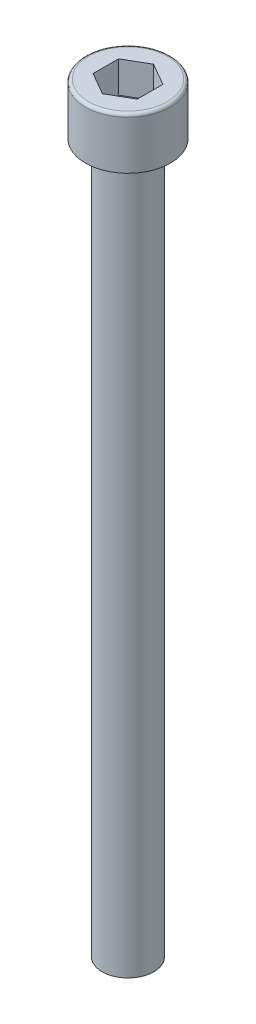
ISO-10303-21;
HEADER;
FILE_DESCRIPTION(('STEP AP214'),'2;1');
FILE_NAME('part.step','',(''),(''),'','','');
FILE_SCHEMA(('AUTOMOTIVE_DESIGN { 1 0 10303 214 1 1 1 1 }'));
ENDSEC;
DATA;
#1=APPLICATION_CONTEXT('core data for automotive mechanical design processes');
#2=APPLICATION_PROTOCOL_DEFINITION('international standard','automotive_design',2000,#1);
#3=PRODUCT_CONTEXT('',#1,'mechanical');
#4=PRODUCT('Part','Part','',(#3));
#5=PRODUCT_RELATED_PRODUCT_CATEGORY('part','',(#4));
#6=PRODUCT_DEFINITION_FORMATION('','',#4);
#7=PRODUCT_DEFINITION_CONTEXT('part definition',#1,'design');
#8=PRODUCT_DEFINITION('design','',#6,#7);
#9=PRODUCT_DEFINITION_SHAPE('','',#8);
#10=(LENGTH_UNIT() NAMED_UNIT(*) SI_UNIT(.MILLI.,.METRE.));
#11=(NAMED_UNIT(*) PLANE_ANGLE_UNIT() SI_UNIT($,.RADIAN.));
#12=(NAMED_UNIT(*) SI_UNIT($,.STERADIAN.) SOLID_ANGLE_UNIT());
#13=UNCERTAINTY_MEASURE_WITH_UNIT(LENGTH_MEASURE(1.E-05),#10,'distance_accuracy_value','');
#14=(GEOMETRIC_REPRESENTATION_CONTEXT(3) GLOBAL_UNCERTAINTY_ASSIGNED_CONTEXT((#13)) GLOBAL_UNIT_ASSIGNED_CONTEXT((#10,
#11,#12)) REPRESENTATION_CONTEXT('',''));
#15=CARTESIAN_POINT('',(0.,0.,0.));
#16=DIRECTION('',(0.,0.,1.));
#17=DIRECTION('',(1.,0.,0.));
#18=AXIS2_PLACEMENT_3D('',#15,#16,#17);
#19=CARTESIAN_POINT('',(0.,-57.15,0.));
#20=DIRECTION('',(0.,1.,0.));
#21=DIRECTION('',(0.,0.,1.));
#22=AXIS2_PLACEMENT_3D('',#19,#20,#21);
#23=CYLINDRICAL_SURFACE('',#22,2.0828);
#24=CARTESIAN_POINT('',(0.,-57.15,0.));
#25=DIRECTION('',(0.,1.,0.));
#26=DIRECTION('',(0.,0.,1.));
#27=AXIS2_PLACEMENT_3D('',#24,#25,#26);
#28=CIRCLE('',#27,2.0828);
#29=CARTESIAN_POINT('',(0.,-57.15,2.0828));
#30=VERTEX_POINT('',#29);
#31=EDGE_CURVE('E144',#30,#30,#28,.T.);
#32=ORIENTED_EDGE('',*,*,#31,.T.);
#33=EDGE_LOOP('',(#32));
#34=FACE_BOUND('',#33,.T.);
#35=CARTESIAN_POINT('',(0.,0.,0.));
#36=DIRECTION('',(0.,1.,0.));
#37=DIRECTION('',(0.,0.,1.));
#38=AXIS2_PLACEMENT_3D('',#35,#36,#37);
#39=CIRCLE('',#38,2.0828);
#40=CARTESIAN_POINT('',(0.,0.,2.0828));
#41=VERTEX_POINT('',#40);
#42=EDGE_CURVE('E143',#41,#41,#39,.T.);
#43=ORIENTED_EDGE('',*,*,#42,.F.);
#44=EDGE_LOOP('',(#43));
#45=FACE_BOUND('',#44,.T.);
#46=ADVANCED_FACE('F33',(#34,#45),#23,.T.);
#47=CARTESIAN_POINT('',(0.,-57.15,0.));
#48=DIRECTION('',(0.,1.,0.));
#49=DIRECTION('',(0.,0.,1.));
#50=AXIS2_PLACEMENT_3D('',#47,#48,#49);
#51=PLANE('',#50);
#52=ORIENTED_EDGE('',*,*,#31,.F.);
#53=EDGE_LOOP('',(#52));
#54=FACE_BOUND('',#53,.T.);
#55=ADVANCED_FACE('F167',(#54),#51,.F.);
#56=CARTESIAN_POINT('',(0.,4.1656,0.));
#57=DIRECTION('',(0.,-1.,0.));
#58=DIRECTION('',(0.,0.,-1.));
#59=AXIS2_PLACEMENT_3D('',#56,#57,#58);
#60=CYLINDRICAL_SURFACE('',#59,3.429);
#61=CARTESIAN_POINT('',(0.,3.9116,0.));
#62=DIRECTION('',(0.,1.,0.));
#63=DIRECTION('',(0.,0.,1.));
#64=AXIS2_PLACEMENT_3D('',#61,#62,#63);
#65=CIRCLE('',#64,3.429);
#66=CARTESIAN_POINT('',(0.,3.9116,3.429));
#67=VERTEX_POINT('',#66);
#68=EDGE_CURVE('E11',#67,#67,#65,.F.);
#69=ORIENTED_EDGE('',*,*,#68,.T.);
#70=EDGE_LOOP('',(#69));
#71=FACE_BOUND('',#70,.T.);
#72=CARTESIAN_POINT('',(0.,0.,0.));
#73=DIRECTION('',(0.,1.,0.));
#74=DIRECTION('',(0.,0.,1.));
#75=AXIS2_PLACEMENT_3D('',#72,#73,#74);
#76=CIRCLE('',#75,3.429);
#77=CARTESIAN_POINT('',(0.,0.,3.429));
#78=VERTEX_POINT('',#77);
#79=EDGE_CURVE('E135',#78,#78,#76,.T.);
#80=ORIENTED_EDGE('',*,*,#79,.T.);
#81=EDGE_LOOP('',(#80));
#82=FACE_BOUND('',#81,.T.);
#83=ADVANCED_FACE('F172',(#71,#82),#60,.T.);
#84=CARTESIAN_POINT('',(0.,4.1656,0.));
#85=DIRECTION('',(0.,1.,0.));
#86=DIRECTION('',(0.,0.,1.));
#87=AXIS2_PLACEMENT_3D('',#84,#85,#86);
#88=PLANE('',#87);
#89=DIRECTION('',(-0.866025403784439,0.,-0.5));
#90=VECTOR('',#89,1.);
#91=CARTESIAN_POINT('',(1.7859375,4.1656,-1.03111149638085));
#92=LINE('',#91,#90);
#93=CARTESIAN_POINT('',(1.7859375,4.1656,-1.03111149638085));
#94=VERTEX_POINT('',#93);
#95=CARTESIAN_POINT('',(0.,4.1656,-2.0622229927617));
#96=VERTEX_POINT('',#95);
#97=EDGE_CURVE('E48',#94,#96,#92,.T.);
#98=ORIENTED_EDGE('',*,*,#97,.F.);
#99=DIRECTION('',(0.,0.,-1.));
#100=VECTOR('',#99,1.);
#101=CARTESIAN_POINT('',(1.7859375,4.1656,1.03111149638085));
#102=LINE('',#101,#100);
#103=CARTESIAN_POINT('',(1.7859375,4.1656,1.03111149638085));
#104=VERTEX_POINT('',#103);
#105=EDGE_CURVE('E131',#104,#94,#102,.T.);
#106=ORIENTED_EDGE('',*,*,#105,.F.);
#107=DIRECTION('',(0.866025403784439,0.,-0.5));
#108=VECTOR('',#107,1.);
#109=CARTESIAN_POINT('',(0.,4.1656,2.0622229927617));
#110=LINE('',#109,#108);
#111=CARTESIAN_POINT('',(0.,4.1656,2.0622229927617));
#112=VERTEX_POINT('',#111);
#113=EDGE_CURVE('E129',#112,#104,#110,.T.);
#114=ORIENTED_EDGE('',*,*,#113,.F.);
#115=DIRECTION('',(0.866025403784439,0.,0.5));
#116=VECTOR('',#115,1.);
#117=CARTESIAN_POINT('',(-1.7859375,4.1656,1.03111149638085));
#118=LINE('',#117,#116);
#119=CARTESIAN_POINT('',(-1.7859375,4.1656,1.03111149638085));
#120=VERTEX_POINT('',#119);
#121=EDGE_CURVE('E96',#120,#112,#118,.T.);
#122=ORIENTED_EDGE('',*,*,#121,.F.);
#123=DIRECTION('',(0.,0.,1.));
#124=VECTOR('',#123,1.);
#125=CARTESIAN_POINT('',(-1.7859375,4.1656,-1.03111149638085));
#126=LINE('',#125,#124);
#127=CARTESIAN_POINT('',(-1.7859375,4.1656,-1.03111149638085));
#128=VERTEX_POINT('',#127);
#129=EDGE_CURVE('E125',#128,#120,#126,.T.);
#130=ORIENTED_EDGE('',*,*,#129,.F.);
#131=DIRECTION('',(-0.866025403784439,0.,0.5));
#132=VECTOR('',#131,1.);
#133=CARTESIAN_POINT('',(0.,4.1656,-2.0622229927617));
#134=LINE('',#133,#132);
#135=EDGE_CURVE('E122',#96,#128,#134,.T.);
#136=ORIENTED_EDGE('',*,*,#135,.F.);
#137=EDGE_LOOP('',(#98,#106,#114,#122,#130,#136));
#138=FACE_BOUND('',#137,.T.);
#139=CARTESIAN_POINT('',(0.,4.1656,0.));
#140=DIRECTION('',(0.,1.,0.));
#141=DIRECTION('',(0.,0.,1.));
#142=AXIS2_PLACEMENT_3D('',#139,#140,#141);
#143=CIRCLE('',#142,3.175);
#144=CARTESIAN_POINT('',(0.,4.1656,3.175));
#145=VERTEX_POINT('',#144);
#146=EDGE_CURVE('E41',#145,#145,#143,.T.);
#147=ORIENTED_EDGE('',*,*,#146,.T.);
#148=EDGE_LOOP('',(#147));
#149=FACE_BOUND('',#148,.T.);
#150=ADVANCED_FACE('F151',(#138,#149),#88,.T.);
#151=CARTESIAN_POINT('',(0.,0.,0.));
#152=DIRECTION('',(0.,1.,0.));
#153=DIRECTION('',(0.,0.,1.));
#154=AXIS2_PLACEMENT_3D('',#151,#152,#153);
#155=PLANE('',#154);
#156=ORIENTED_EDGE('',*,*,#42,.T.);
#157=EDGE_LOOP('',(#156));
#158=FACE_BOUND('',#157,.T.);
#159=ORIENTED_EDGE('',*,*,#79,.F.);
#160=EDGE_LOOP('',(#159));
#161=FACE_BOUND('',#160,.T.);
#162=ADVANCED_FACE('F155',(#158,#161),#155,.F.);
#163=CARTESIAN_POINT('',(0.,3.9116,0.));
#164=DIRECTION('',(0.,1.,0.));
#165=DIRECTION('',(0.,0.,1.));
#166=AXIS2_PLACEMENT_3D('',#163,#164,#165);
#167=TOROIDAL_SURFACE('',#166,3.175,0.254);
#168=ORIENTED_EDGE('',*,*,#68,.F.);
#169=EDGE_LOOP('',(#168));
#170=FACE_BOUND('',#169,.T.);
#171=ORIENTED_EDGE('',*,*,#146,.F.);
#172=EDGE_LOOP('',(#171));
#173=FACE_BOUND('',#172,.T.);
#174=ADVANCED_FACE('F35',(#170,#173),#167,.T.);
#175=CARTESIAN_POINT('',(1.7859375,1.6256,-1.03111149638085));
#176=DIRECTION('',(0.5,0.,-0.866025403784439));
#177=DIRECTION('',(-0.866025403784439,0.,-0.5));
#178=AXIS2_PLACEMENT_3D('',#175,#176,#177);
#179=PLANE('',#178);
#180=ORIENTED_EDGE('',*,*,#97,.T.);
#181=DIRECTION('',(0.,1.,0.));
#182=VECTOR('',#181,1.);
#183=CARTESIAN_POINT('',(0.,1.6256,-2.0622229927617));
#184=LINE('',#183,#182);
#185=CARTESIAN_POINT('',(0.,1.6256,-2.0622229927617));
#186=VERTEX_POINT('',#185);
#187=EDGE_CURVE('E78',#186,#96,#184,.T.);
#188=ORIENTED_EDGE('',*,*,#187,.F.);
#189=DIRECTION('',(-0.866025403784439,0.,-0.5));
#190=VECTOR('',#189,1.);
#191=CARTESIAN_POINT('',(1.7859375,1.6256,-1.03111149638085));
#192=LINE('',#191,#190);
#193=CARTESIAN_POINT('',(1.7859375,1.6256,-1.03111149638085));
#194=VERTEX_POINT('',#193);
#195=EDGE_CURVE('E133',#194,#186,#192,.T.);
#196=ORIENTED_EDGE('',*,*,#195,.F.);
#197=DIRECTION('',(0.,1.,0.));
#198=VECTOR('',#197,1.);
#199=CARTESIAN_POINT('',(1.7859375,1.6256,-1.03111149638085));
#200=LINE('',#199,#198);
#201=EDGE_CURVE('E56',#194,#94,#200,.T.);
#202=ORIENTED_EDGE('',*,*,#201,.T.);
#203=EDGE_LOOP('',(#180,#188,#196,#202));
#204=FACE_BOUND('',#203,.T.);
#205=ADVANCED_FACE('F154',(#204),#179,.F.);
#206=CARTESIAN_POINT('',(1.7859375,1.6256,1.03111149638085));
#207=DIRECTION('',(1.,0.,0.));
#208=DIRECTION('',(0.,0.,-1.));
#209=AXIS2_PLACEMENT_3D('',#206,#207,#208);
#210=PLANE('',#209);
#211=ORIENTED_EDGE('',*,*,#105,.T.);
#212=ORIENTED_EDGE('',*,*,#201,.F.);
#213=DIRECTION('',(0.,0.,-1.));
#214=VECTOR('',#213,1.);
#215=CARTESIAN_POINT('',(1.7859375,1.6256,1.03111149638085));
#216=LINE('',#215,#214);
#217=CARTESIAN_POINT('',(1.7859375,1.6256,1.03111149638085));
#218=VERTEX_POINT('',#217);
#219=EDGE_CURVE('E108',#218,#194,#216,.T.);
#220=ORIENTED_EDGE('',*,*,#219,.F.);
#221=DIRECTION('',(0.,1.,0.));
#222=VECTOR('',#221,1.);
#223=CARTESIAN_POINT('',(1.7859375,1.6256,1.03111149638085));
#224=LINE('',#223,#222);
#225=EDGE_CURVE('E100',#218,#104,#224,.T.);
#226=ORIENTED_EDGE('',*,*,#225,.T.);
#227=EDGE_LOOP('',(#211,#212,#220,#226));
#228=FACE_BOUND('',#227,.T.);
#229=ADVANCED_FACE('F161',(#228),#210,.F.);
#230=CARTESIAN_POINT('',(0.,1.6256,2.0622229927617));
#231=DIRECTION('',(0.5,0.,0.866025403784439));
#232=DIRECTION('',(0.866025403784439,0.,-0.5));
#233=AXIS2_PLACEMENT_3D('',#230,#231,#232);
#234=PLANE('',#233);
#235=ORIENTED_EDGE('',*,*,#113,.T.);
#236=ORIENTED_EDGE('',*,*,#225,.F.);
#237=DIRECTION('',(0.866025403784439,0.,-0.5));
#238=VECTOR('',#237,1.);
#239=CARTESIAN_POINT('',(0.,1.6256,2.0622229927617));
#240=LINE('',#239,#238);
#241=CARTESIAN_POINT('',(0.,1.6256,2.0622229927617));
#242=VERTEX_POINT('',#241);
#243=EDGE_CURVE('E104',#242,#218,#240,.T.);
#244=ORIENTED_EDGE('',*,*,#243,.F.);
#245=DIRECTION('',(0.,1.,0.));
#246=VECTOR('',#245,1.);
#247=CARTESIAN_POINT('',(0.,1.6256,2.0622229927617));
#248=LINE('',#247,#246);
#249=EDGE_CURVE('E89',#242,#112,#248,.T.);
#250=ORIENTED_EDGE('',*,*,#249,.T.);
#251=EDGE_LOOP('',(#235,#236,#244,#250));
#252=FACE_BOUND('',#251,.T.);
#253=ADVANCED_FACE('F105',(#252),#234,.F.);
#254=CARTESIAN_POINT('',(-1.7859375,1.6256,1.03111149638085));
#255=DIRECTION('',(-0.5,0.,0.866025403784439));
#256=DIRECTION('',(0.866025403784439,0.,0.5));
#257=AXIS2_PLACEMENT_3D('',#254,#255,#256);
#258=PLANE('',#257);
#259=ORIENTED_EDGE('',*,*,#121,.T.);
#260=ORIENTED_EDGE('',*,*,#249,.F.);
#261=DIRECTION('',(0.866025403784439,0.,0.5));
#262=VECTOR('',#261,1.);
#263=CARTESIAN_POINT('',(-1.7859375,1.6256,1.03111149638085));
#264=LINE('',#263,#262);
#265=CARTESIAN_POINT('',(-1.7859375,1.6256,1.03111149638085));
#266=VERTEX_POINT('',#265);
#267=EDGE_CURVE('E93',#266,#242,#264,.T.);
#268=ORIENTED_EDGE('',*,*,#267,.F.);
#269=DIRECTION('',(0.,1.,0.));
#270=VECTOR('',#269,1.);
#271=CARTESIAN_POINT('',(-1.7859375,1.6256,1.03111149638085));
#272=LINE('',#271,#270);
#273=EDGE_CURVE('E101',#266,#120,#272,.T.);
#274=ORIENTED_EDGE('',*,*,#273,.T.);
#275=EDGE_LOOP('',(#259,#260,#268,#274));
#276=FACE_BOUND('',#275,.T.);
#277=ADVANCED_FACE('F91',(#276),#258,.F.);
#278=CARTESIAN_POINT('',(-1.7859375,1.6256,-1.03111149638085));
#279=DIRECTION('',(-1.,0.,0.));
#280=DIRECTION('',(0.,0.,1.));
#281=AXIS2_PLACEMENT_3D('',#278,#279,#280);
#282=PLANE('',#281);
#283=ORIENTED_EDGE('',*,*,#129,.T.);
#284=ORIENTED_EDGE('',*,*,#273,.F.);
#285=DIRECTION('',(0.,0.,1.));
#286=VECTOR('',#285,1.);
#287=CARTESIAN_POINT('',(-1.7859375,1.6256,-1.03111149638085));
#288=LINE('',#287,#286);
#289=CARTESIAN_POINT('',(-1.7859375,1.6256,-1.03111149638085));
#290=VERTEX_POINT('',#289);
#291=EDGE_CURVE('E114',#290,#266,#288,.T.);
#292=ORIENTED_EDGE('',*,*,#291,.F.);
#293=DIRECTION('',(0.,1.,0.));
#294=VECTOR('',#293,1.);
#295=CARTESIAN_POINT('',(-1.7859375,1.6256,-1.03111149638085));
#296=LINE('',#295,#294);
#297=EDGE_CURVE('E138',#290,#128,#296,.T.);
#298=ORIENTED_EDGE('',*,*,#297,.T.);
#299=EDGE_LOOP('',(#283,#284,#292,#298));
#300=FACE_BOUND('',#299,.T.);
#301=ADVANCED_FACE('F186',(#300),#282,.F.);
#302=CARTESIAN_POINT('',(0.,1.6256,-2.0622229927617));
#303=DIRECTION('',(-0.5,0.,-0.866025403784439));
#304=DIRECTION('',(-0.866025403784439,0.,0.5));
#305=AXIS2_PLACEMENT_3D('',#302,#303,#304);
#306=PLANE('',#305);
#307=ORIENTED_EDGE('',*,*,#135,.T.);
#308=ORIENTED_EDGE('',*,*,#297,.F.);
#309=DIRECTION('',(-0.866025403784439,0.,0.5));
#310=VECTOR('',#309,1.);
#311=CARTESIAN_POINT('',(0.,1.6256,-2.0622229927617));
#312=LINE('',#311,#310);
#313=EDGE_CURVE('E116',#186,#290,#312,.T.);
#314=ORIENTED_EDGE('',*,*,#313,.F.);
#315=ORIENTED_EDGE('',*,*,#187,.T.);
#316=EDGE_LOOP('',(#307,#308,#314,#315));
#317=FACE_BOUND('',#316,.T.);
#318=ADVANCED_FACE('F183',(#317),#306,.F.);
#319=CARTESIAN_POINT('',(0.,1.6256,0.));
#320=DIRECTION('',(0.,1.,0.));
#321=DIRECTION('',(0.,0.,1.));
#322=AXIS2_PLACEMENT_3D('',#319,#320,#321);
#323=PLANE('',#322);
#324=ORIENTED_EDGE('',*,*,#195,.T.);
#325=ORIENTED_EDGE('',*,*,#313,.T.);
#326=ORIENTED_EDGE('',*,*,#291,.T.);
#327=ORIENTED_EDGE('',*,*,#267,.T.);
#328=ORIENTED_EDGE('',*,*,#243,.T.);
#329=ORIENTED_EDGE('',*,*,#219,.T.);
#330=EDGE_LOOP('',(#324,#325,#326,#327,#328,#329));
#331=FACE_BOUND('',#330,.T.);
#332=ADVANCED_FACE('F111',(#331),#323,.T.);
#333=CLOSED_SHELL('',(#46,#55,#83,#150,#162,#174,#205,#229,#253,#277,#301,#318,#332));
#334=MANIFOLD_SOLID_BREP('B2',#333);
#335=ADVANCED_BREP_SHAPE_REPRESENTATION('',(#18,#334),#14);
#336=SHAPE_DEFINITION_REPRESENTATION(#9,#335);
ENDSEC;
END-ISO-10303-21;
